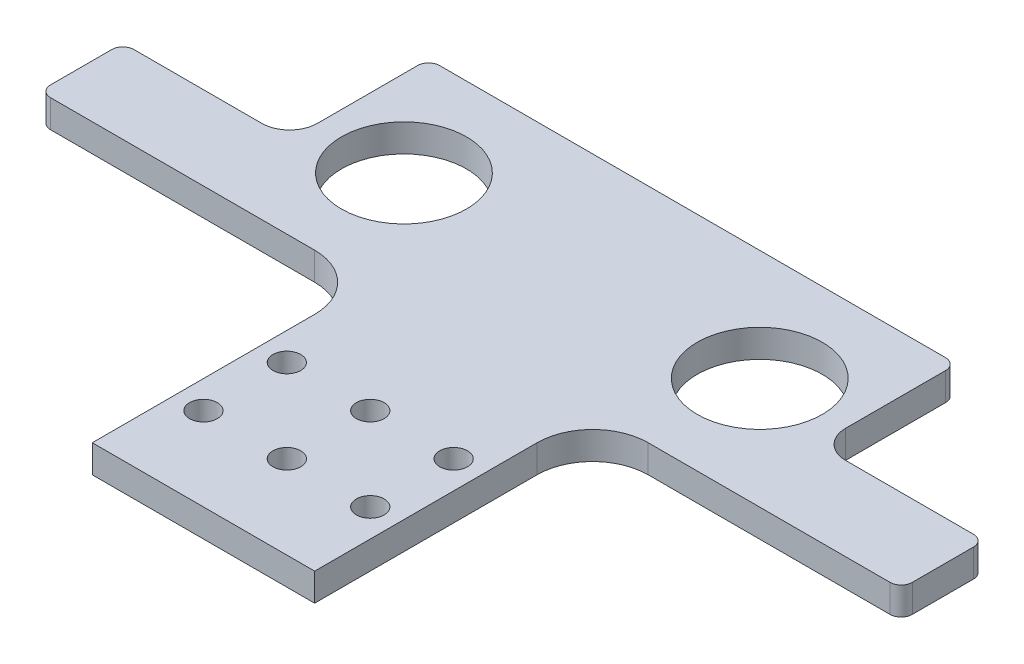
ISO-10303-21;
HEADER;
FILE_DESCRIPTION(('STEP AP214'),'2;1');
FILE_NAME('part.step','',(''),(''),'','','');
FILE_SCHEMA(('AUTOMOTIVE_DESIGN { 1 0 10303 214 1 1 1 1 }'));
ENDSEC;
DATA;
#1=APPLICATION_CONTEXT('core data for automotive mechanical design processes');
#2=APPLICATION_PROTOCOL_DEFINITION('international standard','automotive_design',2000,#1);
#3=PRODUCT_CONTEXT('',#1,'mechanical');
#4=PRODUCT('Part','Part','',(#3));
#5=PRODUCT_RELATED_PRODUCT_CATEGORY('part','',(#4));
#6=PRODUCT_DEFINITION_FORMATION('','',#4);
#7=PRODUCT_DEFINITION_CONTEXT('part definition',#1,'design');
#8=PRODUCT_DEFINITION('design','',#6,#7);
#9=PRODUCT_DEFINITION_SHAPE('','',#8);
#10=(LENGTH_UNIT() NAMED_UNIT(*) SI_UNIT(.MILLI.,.METRE.));
#11=(NAMED_UNIT(*) PLANE_ANGLE_UNIT() SI_UNIT($,.RADIAN.));
#12=(NAMED_UNIT(*) SI_UNIT($,.STERADIAN.) SOLID_ANGLE_UNIT());
#13=UNCERTAINTY_MEASURE_WITH_UNIT(LENGTH_MEASURE(1.E-05),#10,'distance_accuracy_value','');
#14=(GEOMETRIC_REPRESENTATION_CONTEXT(3) GLOBAL_UNCERTAINTY_ASSIGNED_CONTEXT((#13)) GLOBAL_UNIT_ASSIGNED_CONTEXT((#10,
#11,#12)) REPRESENTATION_CONTEXT('',''));
#15=CARTESIAN_POINT('',(0.,0.,0.));
#16=DIRECTION('',(0.,0.,1.));
#17=DIRECTION('',(1.,0.,0.));
#18=AXIS2_PLACEMENT_3D('',#15,#16,#17);
#19=CARTESIAN_POINT('',(29.5142708333333,0.,35.2689583333334));
#20=DIRECTION('',(0.,1.,0.));
#21=DIRECTION('',(0.,0.,1.));
#22=AXIS2_PLACEMENT_3D('',#19,#20,#21);
#23=CYLINDRICAL_SURFACE('',#22,3.175);
#24=CARTESIAN_POINT('',(29.5142708333333,0.,35.2689583333334));
#25=DIRECTION('',(0.,1.,0.));
#26=DIRECTION('',(0.,0.,1.));
#27=AXIS2_PLACEMENT_3D('',#24,#25,#26);
#28=CIRCLE('',#27,3.175);
#29=CARTESIAN_POINT('',(29.5142708333333,0.,38.4439583333333));
#30=VERTEX_POINT('',#29);
#31=EDGE_CURVE('E44',#30,#30,#28,.T.);
#32=ORIENTED_EDGE('',*,*,#31,.F.);
#33=EDGE_LOOP('',(#32));
#34=FACE_BOUND('',#33,.T.);
#35=CARTESIAN_POINT('',(29.5142708333333,6.35,35.2689583333334));
#36=DIRECTION('',(0.,1.,0.));
#37=DIRECTION('',(0.,0.,1.));
#38=AXIS2_PLACEMENT_3D('',#35,#36,#37);
#39=CIRCLE('',#38,3.175);
#40=CARTESIAN_POINT('',(29.5142708333333,6.35,38.4439583333333));
#41=VERTEX_POINT('',#40);
#42=EDGE_CURVE('E11',#41,#41,#39,.T.);
#43=ORIENTED_EDGE('',*,*,#42,.T.);
#44=EDGE_LOOP('',(#43));
#45=FACE_BOUND('',#44,.T.);
#46=ADVANCED_FACE('F37',(#34,#45),#23,.F.);
#47=CARTESIAN_POINT('',(10.4642708333333,0.,35.2689583333334));
#48=DIRECTION('',(0.,1.,0.));
#49=DIRECTION('',(0.,0.,1.));
#50=AXIS2_PLACEMENT_3D('',#47,#48,#49);
#51=CYLINDRICAL_SURFACE('',#50,3.175);
#52=CARTESIAN_POINT('',(10.4642708333333,0.,35.2689583333334));
#53=DIRECTION('',(0.,1.,0.));
#54=DIRECTION('',(0.,0.,1.));
#55=AXIS2_PLACEMENT_3D('',#52,#53,#54);
#56=CIRCLE('',#55,3.175);
#57=CARTESIAN_POINT('',(10.4642708333333,0.,38.4439583333333));
#58=VERTEX_POINT('',#57);
#59=EDGE_CURVE('E378',#58,#58,#56,.T.);
#60=ORIENTED_EDGE('',*,*,#59,.F.);
#61=EDGE_LOOP('',(#60));
#62=FACE_BOUND('',#61,.T.);
#63=CARTESIAN_POINT('',(10.4642708333333,6.35,35.2689583333334));
#64=DIRECTION('',(0.,1.,0.));
#65=DIRECTION('',(0.,0.,1.));
#66=AXIS2_PLACEMENT_3D('',#63,#64,#65);
#67=CIRCLE('',#66,3.175);
#68=CARTESIAN_POINT('',(10.4642708333333,6.35,38.4439583333333));
#69=VERTEX_POINT('',#68);
#70=EDGE_CURVE('E381',#69,#69,#67,.T.);
#71=ORIENTED_EDGE('',*,*,#70,.T.);
#72=EDGE_LOOP('',(#71));
#73=FACE_BOUND('',#72,.T.);
#74=ADVANCED_FACE('F389',(#62,#73),#51,.F.);
#75=CARTESIAN_POINT('',(-8.58572916666669,0.,35.2689583333334));
#76=DIRECTION('',(0.,1.,0.));
#77=DIRECTION('',(0.,0.,1.));
#78=AXIS2_PLACEMENT_3D('',#75,#76,#77);
#79=CYLINDRICAL_SURFACE('',#78,3.175);
#80=CARTESIAN_POINT('',(-8.58572916666669,0.,35.2689583333334));
#81=DIRECTION('',(0.,1.,0.));
#82=DIRECTION('',(0.,0.,1.));
#83=AXIS2_PLACEMENT_3D('',#80,#81,#82);
#84=CIRCLE('',#83,3.175);
#85=CARTESIAN_POINT('',(-8.58572916666669,0.,38.4439583333334));
#86=VERTEX_POINT('',#85);
#87=EDGE_CURVE('E372',#86,#86,#84,.T.);
#88=ORIENTED_EDGE('',*,*,#87,.F.);
#89=EDGE_LOOP('',(#88));
#90=FACE_BOUND('',#89,.T.);
#91=CARTESIAN_POINT('',(-8.58572916666669,6.35,35.2689583333334));
#92=DIRECTION('',(0.,1.,0.));
#93=DIRECTION('',(0.,0.,1.));
#94=AXIS2_PLACEMENT_3D('',#91,#92,#93);
#95=CIRCLE('',#94,3.175);
#96=CARTESIAN_POINT('',(-8.58572916666669,6.35,38.4439583333334));
#97=VERTEX_POINT('',#96);
#98=EDGE_CURVE('E375',#97,#97,#95,.T.);
#99=ORIENTED_EDGE('',*,*,#98,.T.);
#100=EDGE_LOOP('',(#99));
#101=FACE_BOUND('',#100,.T.);
#102=ADVANCED_FACE('F469',(#90,#101),#79,.F.);
#103=CARTESIAN_POINT('',(29.5142708333333,0.,54.3189583333333));
#104=DIRECTION('',(0.,1.,0.));
#105=DIRECTION('',(0.,0.,1.));
#106=AXIS2_PLACEMENT_3D('',#103,#104,#105);
#107=CYLINDRICAL_SURFACE('',#106,3.175);
#108=CARTESIAN_POINT('',(29.5142708333333,0.,54.3189583333333));
#109=DIRECTION('',(0.,1.,0.));
#110=DIRECTION('',(0.,0.,1.));
#111=AXIS2_PLACEMENT_3D('',#108,#109,#110);
#112=CIRCLE('',#111,3.175);
#113=CARTESIAN_POINT('',(29.5142708333333,0.,57.4939583333333));
#114=VERTEX_POINT('',#113);
#115=EDGE_CURVE('E366',#114,#114,#112,.T.);
#116=ORIENTED_EDGE('',*,*,#115,.F.);
#117=EDGE_LOOP('',(#116));
#118=FACE_BOUND('',#117,.T.);
#119=CARTESIAN_POINT('',(29.5142708333333,6.35,54.3189583333333));
#120=DIRECTION('',(0.,1.,0.));
#121=DIRECTION('',(0.,0.,1.));
#122=AXIS2_PLACEMENT_3D('',#119,#120,#121);
#123=CIRCLE('',#122,3.175);
#124=CARTESIAN_POINT('',(29.5142708333333,6.35,57.4939583333333));
#125=VERTEX_POINT('',#124);
#126=EDGE_CURVE('E369',#125,#125,#123,.T.);
#127=ORIENTED_EDGE('',*,*,#126,.T.);
#128=EDGE_LOOP('',(#127));
#129=FACE_BOUND('',#128,.T.);
#130=ADVANCED_FACE('F466',(#118,#129),#107,.F.);
#131=CARTESIAN_POINT('',(-52.4007291666667,6.35,9.86895833333334));
#132=DIRECTION('',(0.,0.,-1.));
#133=DIRECTION('',(-1.,0.,0.));
#134=AXIS2_PLACEMENT_3D('',#131,#132,#133);
#135=PLANE('',#134);
#136=DIRECTION('',(1.,0.,0.));
#137=VECTOR('',#136,1.);
#138=CARTESIAN_POINT('',(-52.4007291666667,6.35,9.86895833333334));
#139=LINE('',#138,#137);
#140=CARTESIAN_POINT('',(48.5642708333333,6.35,9.86895833333334));
#141=VERTEX_POINT('',#140);
#142=CARTESIAN_POINT('',(103.809270833333,6.35,9.86895833333334));
#143=VERTEX_POINT('',#142);
#144=EDGE_CURVE('E263',#141,#143,#139,.T.);
#145=ORIENTED_EDGE('',*,*,#144,.F.);
#146=DIRECTION('',(0.,1.,0.));
#147=VECTOR('',#146,1.);
#148=CARTESIAN_POINT('',(48.5642708333333,0.,9.86895833333334));
#149=LINE('',#148,#147);
#150=CARTESIAN_POINT('',(48.5642708333333,0.,9.86895833333334));
#151=VERTEX_POINT('',#150);
#152=EDGE_CURVE('E353',#141,#151,#149,.F.);
#153=ORIENTED_EDGE('',*,*,#152,.T.);
#154=DIRECTION('',(1.,0.,0.));
#155=VECTOR('',#154,1.);
#156=CARTESIAN_POINT('',(-52.4007291666667,0.,9.86895833333334));
#157=LINE('',#156,#155);
#158=CARTESIAN_POINT('',(103.809270833333,0.,9.86895833333334));
#159=VERTEX_POINT('',#158);
#160=EDGE_CURVE('E274',#151,#159,#157,.T.);
#161=ORIENTED_EDGE('',*,*,#160,.T.);
#162=DIRECTION('',(0.,1.,0.));
#163=VECTOR('',#162,1.);
#164=CARTESIAN_POINT('',(103.809270833333,6.35,9.86895833333334));
#165=LINE('',#164,#163);
#166=EDGE_CURVE('E297',#159,#143,#165,.T.);
#167=ORIENTED_EDGE('',*,*,#166,.T.);
#168=EDGE_LOOP('',(#145,#153,#161,#167));
#169=FACE_BOUND('',#168,.T.);
#170=ADVANCED_FACE('F407',(#169),#135,.F.);
#171=CARTESIAN_POINT('',(68.2492708333333,6.35,9.86895833333334));
#172=DIRECTION('',(-1.,0.,0.));
#173=DIRECTION('',(0.,0.,1.));
#174=AXIS2_PLACEMENT_3D('',#171,#172,#173);
#175=PLANE('',#174);
#176=DIRECTION('',(0.,0.,-1.));
#177=VECTOR('',#176,1.);
#178=CARTESIAN_POINT('',(68.2492708333333,0.,9.86895833333334));
#179=LINE('',#178,#177);
#180=CARTESIAN_POINT('',(68.2492708333333,0.,-15.5310416666667));
#181=VERTEX_POINT('',#180);
#182=CARTESIAN_POINT('',(68.2492708333333,0.,-38.3910416666667));
#183=VERTEX_POINT('',#182);
#184=EDGE_CURVE('E251',#181,#183,#179,.T.);
#185=ORIENTED_EDGE('',*,*,#184,.T.);
#186=DIRECTION('',(0.,-1.,0.));
#187=VECTOR('',#186,1.);
#188=CARTESIAN_POINT('',(68.2492708333333,6.35,-38.3910416666667));
#189=LINE('',#188,#187);
#190=CARTESIAN_POINT('',(68.2492708333333,6.35,-38.3910416666667));
#191=VERTEX_POINT('',#190);
#192=EDGE_CURVE('E348',#183,#191,#189,.F.);
#193=ORIENTED_EDGE('',*,*,#192,.T.);
#194=DIRECTION('',(0.,0.,-1.));
#195=VECTOR('',#194,1.);
#196=CARTESIAN_POINT('',(68.2492708333333,6.35,9.86895833333334));
#197=LINE('',#196,#195);
#198=CARTESIAN_POINT('',(68.2492708333333,6.35,-15.5310416666667));
#199=VERTEX_POINT('',#198);
#200=EDGE_CURVE('E254',#199,#191,#197,.T.);
#201=ORIENTED_EDGE('',*,*,#200,.F.);
#202=DIRECTION('',(0.,1.,0.));
#203=VECTOR('',#202,1.);
#204=CARTESIAN_POINT('',(68.2492708333333,0.,-15.5310416666667));
#205=LINE('',#204,#203);
#206=EDGE_CURVE('E279',#199,#181,#205,.F.);
#207=ORIENTED_EDGE('',*,*,#206,.T.);
#208=EDGE_LOOP('',(#185,#193,#201,#207));
#209=FACE_BOUND('',#208,.T.);
#210=ADVANCED_FACE('F419',(#209),#175,.F.);
#211=CARTESIAN_POINT('',(-52.4007291666667,6.35,-40.9310416666667));
#212=DIRECTION('',(0.,0.,1.));
#213=DIRECTION('',(1.,0.,0.));
#214=AXIS2_PLACEMENT_3D('',#211,#212,#213);
#215=PLANE('',#214);
#216=DIRECTION('',(-1.,0.,0.));
#217=VECTOR('',#216,1.);
#218=CARTESIAN_POINT('',(-52.4007291666667,0.,-40.9310416666667));
#219=LINE('',#218,#217);
#220=CARTESIAN_POINT('',(65.7092708333333,0.,-40.9310416666667));
#221=VERTEX_POINT('',#220);
#222=CARTESIAN_POINT('',(-49.8607291666667,0.,-40.9310416666667));
#223=VERTEX_POINT('',#222);
#224=EDGE_CURVE('E269',#221,#223,#219,.T.);
#225=ORIENTED_EDGE('',*,*,#224,.T.);
#226=DIRECTION('',(0.,-1.,0.));
#227=VECTOR('',#226,1.);
#228=CARTESIAN_POINT('',(-49.8607291666667,6.35,-40.9310416666667));
#229=LINE('',#228,#227);
#230=CARTESIAN_POINT('',(-49.8607291666667,6.35,-40.9310416666667));
#231=VERTEX_POINT('',#230);
#232=EDGE_CURVE('E346',#223,#231,#229,.F.);
#233=ORIENTED_EDGE('',*,*,#232,.T.);
#234=DIRECTION('',(-1.,0.,0.));
#235=VECTOR('',#234,1.);
#236=CARTESIAN_POINT('',(-52.4007291666667,6.35,-40.9310416666667));
#237=LINE('',#236,#235);
#238=CARTESIAN_POINT('',(65.7092708333333,6.35,-40.9310416666667));
#239=VERTEX_POINT('',#238);
#240=EDGE_CURVE('E257',#239,#231,#237,.T.);
#241=ORIENTED_EDGE('',*,*,#240,.F.);
#242=DIRECTION('',(0.,-1.,0.));
#243=VECTOR('',#242,1.);
#244=CARTESIAN_POINT('',(65.7092708333333,6.35,-40.9310416666667));
#245=LINE('',#244,#243);
#246=EDGE_CURVE('E343',#239,#221,#245,.T.);
#247=ORIENTED_EDGE('',*,*,#246,.T.);
#248=EDGE_LOOP('',(#225,#233,#241,#247));
#249=FACE_BOUND('',#248,.T.);
#250=ADVANCED_FACE('F415',(#249),#215,.F.);
#251=CARTESIAN_POINT('',(-52.4007291666667,6.35,9.86895833333334));
#252=DIRECTION('',(1.,0.,0.));
#253=DIRECTION('',(0.,0.,-1.));
#254=AXIS2_PLACEMENT_3D('',#251,#252,#253);
#255=PLANE('',#254);
#256=DIRECTION('',(0.,0.,1.));
#257=VECTOR('',#256,1.);
#258=CARTESIAN_POINT('',(-52.4007291666667,6.35,9.86895833333334));
#259=LINE('',#258,#257);
#260=CARTESIAN_POINT('',(-52.4007291666667,6.35,-38.3910416666667));
#261=VERTEX_POINT('',#260);
#262=CARTESIAN_POINT('',(-52.4007291666667,6.35,-15.5310416666667));
#263=VERTEX_POINT('',#262);
#264=EDGE_CURVE('E261',#261,#263,#259,.T.);
#265=ORIENTED_EDGE('',*,*,#264,.F.);
#266=DIRECTION('',(0.,-1.,0.));
#267=VECTOR('',#266,1.);
#268=CARTESIAN_POINT('',(-52.4007291666667,6.35,-38.3910416666667));
#269=LINE('',#268,#267);
#270=CARTESIAN_POINT('',(-52.4007291666667,0.,-38.3910416666667));
#271=VERTEX_POINT('',#270);
#272=EDGE_CURVE('E340',#261,#271,#269,.T.);
#273=ORIENTED_EDGE('',*,*,#272,.T.);
#274=DIRECTION('',(0.,0.,1.));
#275=VECTOR('',#274,1.);
#276=CARTESIAN_POINT('',(-52.4007291666667,0.,9.86895833333334));
#277=LINE('',#276,#275);
#278=CARTESIAN_POINT('',(-52.4007291666667,0.,-15.5310416666667));
#279=VERTEX_POINT('',#278);
#280=EDGE_CURVE('E272',#271,#279,#277,.T.);
#281=ORIENTED_EDGE('',*,*,#280,.T.);
#282=DIRECTION('',(0.,1.,0.));
#283=VECTOR('',#282,1.);
#284=CARTESIAN_POINT('',(-52.4007291666667,6.35,-15.5310416666667));
#285=LINE('',#284,#283);
#286=EDGE_CURVE('E281',#279,#263,#285,.T.);
#287=ORIENTED_EDGE('',*,*,#286,.T.);
#288=EDGE_LOOP('',(#265,#273,#281,#287));
#289=FACE_BOUND('',#288,.T.);
#290=ADVANCED_FACE('F404',(#289),#255,.F.);
#291=CARTESIAN_POINT('',(-87.9607291666666,0.,9.86895833333334));
#292=VERTEX_POINT('',#291);
#293=CARTESIAN_POINT('',(-27.6357291666667,0.,9.86895833333334));
#294=VERTEX_POINT('',#293);
#295=EDGE_CURVE('E258',#292,#294,#157,.T.);
#296=ORIENTED_EDGE('',*,*,#295,.T.);
#297=DIRECTION('',(0.,1.,0.));
#298=VECTOR('',#297,1.);
#299=CARTESIAN_POINT('',(-27.6357291666667,6.35,9.86895833333334));
#300=LINE('',#299,#298);
#301=CARTESIAN_POINT('',(-27.6357291666667,6.35,9.86895833333334));
#302=VERTEX_POINT('',#301);
#303=EDGE_CURVE('E355',#294,#302,#300,.T.);
#304=ORIENTED_EDGE('',*,*,#303,.T.);
#305=CARTESIAN_POINT('',(-87.9607291666666,6.35,9.86895833333334));
#306=VERTEX_POINT('',#305);
#307=EDGE_CURVE('E264',#306,#302,#139,.T.);
#308=ORIENTED_EDGE('',*,*,#307,.F.);
#309=DIRECTION('',(0.,1.,0.));
#310=VECTOR('',#309,1.);
#311=CARTESIAN_POINT('',(-87.9607291666667,0.,9.86895833333334));
#312=LINE('',#311,#310);
#313=EDGE_CURVE('E295',#306,#292,#312,.F.);
#314=ORIENTED_EDGE('',*,*,#313,.T.);
#315=EDGE_LOOP('',(#296,#304,#308,#314));
#316=FACE_BOUND('',#315,.T.);
#317=ADVANCED_FACE('F394',(#316),#135,.F.);
#318=CARTESIAN_POINT('',(0.,6.35,0.));
#319=DIRECTION('',(0.,-1.,0.));
#320=DIRECTION('',(0.,0.,-1.));
#321=AXIS2_PLACEMENT_3D('',#318,#319,#320);
#322=PLANE('',#321);
#323=CARTESIAN_POINT('',(10.4642708333333,6.35,54.3189583333334));
#324=DIRECTION('',(0.,1.,0.));
#325=DIRECTION('',(0.,0.,1.));
#326=AXIS2_PLACEMENT_3D('',#323,#324,#325);
#327=CIRCLE('',#326,3.175);
#328=CARTESIAN_POINT('',(10.4642708333333,6.35,57.4939583333334));
#329=VERTEX_POINT('',#328);
#330=EDGE_CURVE('E871',#329,#329,#327,.T.);
#331=ORIENTED_EDGE('',*,*,#330,.F.);
#332=EDGE_LOOP('',(#331));
#333=FACE_BOUND('',#332,.T.);
#334=CARTESIAN_POINT('',(-8.58572916666669,6.35,54.3189583333334));
#335=DIRECTION('',(0.,1.,0.));
#336=DIRECTION('',(0.,0.,1.));
#337=AXIS2_PLACEMENT_3D('',#334,#335,#336);
#338=CIRCLE('',#337,3.175);
#339=CARTESIAN_POINT('',(-8.58572916666669,6.35,57.4939583333334));
#340=VERTEX_POINT('',#339);
#341=EDGE_CURVE('E872',#340,#340,#338,.T.);
#342=ORIENTED_EDGE('',*,*,#341,.F.);
#343=EDGE_LOOP('',(#342));
#344=FACE_BOUND('',#343,.T.);
#345=CARTESIAN_POINT('',(48.5642708333333,6.35,-15.6147880502648));
#346=DIRECTION('',(0.,-1.,0.));
#347=DIRECTION('',(0.,0.,1.));
#348=AXIS2_PLACEMENT_3D('',#345,#346,#347);
#349=CIRCLE('',#348,14.2875);
#350=CARTESIAN_POINT('',(48.5642708333333,6.35,-1.32728805026484));
#351=VERTEX_POINT('',#350);
#352=EDGE_CURVE('E237',#351,#351,#349,.T.);
#353=ORIENTED_EDGE('',*,*,#352,.T.);
#354=EDGE_LOOP('',(#353));
#355=FACE_BOUND('',#354,.T.);
#356=CARTESIAN_POINT('',(-32.7157291666667,6.35,-15.6147880502648));
#357=DIRECTION('',(0.,1.,0.));
#358=DIRECTION('',(0.,0.,1.));
#359=AXIS2_PLACEMENT_3D('',#356,#357,#358);
#360=CIRCLE('',#359,14.2875);
#361=CARTESIAN_POINT('',(-32.7157291666667,6.35,-1.32728805026483));
#362=VERTEX_POINT('',#361);
#363=EDGE_CURVE('E245',#362,#362,#360,.T.);
#364=ORIENTED_EDGE('',*,*,#363,.F.);
#365=EDGE_LOOP('',(#364));
#366=FACE_BOUND('',#365,.T.);
#367=ORIENTED_EDGE('',*,*,#307,.T.);
#368=CARTESIAN_POINT('',(-27.6357291666667,6.35,22.5689583333333));
#369=DIRECTION('',(0.,-1.,0.));
#370=DIRECTION('',(0.,0.,-1.));
#371=AXIS2_PLACEMENT_3D('',#368,#369,#370);
#372=CIRCLE('',#371,12.7);
#373=CARTESIAN_POINT('',(-14.9357291666667,6.35,22.5689583333333));
#374=VERTEX_POINT('',#373);
#375=EDGE_CURVE('E59',#302,#374,#372,.T.);
#376=ORIENTED_EDGE('',*,*,#375,.T.);
#377=DIRECTION('',(0.,0.,1.));
#378=VECTOR('',#377,1.);
#379=CARTESIAN_POINT('',(-14.9357291666667,6.35,9.86895833333334));
#380=LINE('',#379,#378);
#381=CARTESIAN_POINT('',(-14.9357291666667,6.35,73.3689583333334));
#382=VERTEX_POINT('',#381);
#383=EDGE_CURVE('E212',#374,#382,#380,.T.);
#384=ORIENTED_EDGE('',*,*,#383,.T.);
#385=DIRECTION('',(1.,0.,0.));
#386=VECTOR('',#385,1.);
#387=CARTESIAN_POINT('',(-14.9357291666667,6.35,73.3689583333334));
#388=LINE('',#387,#386);
#389=CARTESIAN_POINT('',(35.8642708333333,6.35,73.3689583333333));
#390=VERTEX_POINT('',#389);
#391=EDGE_CURVE('E199',#382,#390,#388,.T.);
#392=ORIENTED_EDGE('',*,*,#391,.T.);
#393=DIRECTION('',(0.,0.,1.));
#394=VECTOR('',#393,1.);
#395=CARTESIAN_POINT('',(35.8642708333333,6.35,9.86895833333334));
#396=LINE('',#395,#394);
#397=CARTESIAN_POINT('',(35.8642708333333,6.35,22.5689583333333));
#398=VERTEX_POINT('',#397);
#399=EDGE_CURVE('E192',#398,#390,#396,.T.);
#400=ORIENTED_EDGE('',*,*,#399,.F.);
#401=CARTESIAN_POINT('',(48.5642708333333,6.35,22.5689583333333));
#402=DIRECTION('',(0.,-1.,0.));
#403=DIRECTION('',(0.,0.,-1.));
#404=AXIS2_PLACEMENT_3D('',#401,#402,#403);
#405=CIRCLE('',#404,12.7);
#406=EDGE_CURVE('E359',#398,#141,#405,.T.);
#407=ORIENTED_EDGE('',*,*,#406,.T.);
#408=ORIENTED_EDGE('',*,*,#144,.T.);
#409=CARTESIAN_POINT('',(103.809270833333,6.35,7.32895833333334));
#410=DIRECTION('',(0.,-1.,0.));
#411=DIRECTION('',(0.,0.,-1.));
#412=AXIS2_PLACEMENT_3D('',#409,#410,#411);
#413=CIRCLE('',#412,2.54);
#414=CARTESIAN_POINT('',(106.349270833333,6.35,7.32895833333334));
#415=VERTEX_POINT('',#414);
#416=EDGE_CURVE('E310',#143,#415,#413,.F.);
#417=ORIENTED_EDGE('',*,*,#416,.T.);
#418=DIRECTION('',(0.,0.,1.));
#419=VECTOR('',#418,1.);
#420=CARTESIAN_POINT('',(106.349270833333,6.35,-9.18104166666668));
#421=LINE('',#420,#419);
#422=CARTESIAN_POINT('',(106.349270833333,6.35,-6.64104166666668));
#423=VERTEX_POINT('',#422);
#424=EDGE_CURVE('E217',#423,#415,#421,.T.);
#425=ORIENTED_EDGE('',*,*,#424,.F.);
#426=CARTESIAN_POINT('',(103.809270833333,6.35,-6.64104166666668));
#427=DIRECTION('',(0.,-1.,0.));
#428=DIRECTION('',(0.,0.,-1.));
#429=AXIS2_PLACEMENT_3D('',#426,#427,#428);
#430=CIRCLE('',#429,2.54);
#431=CARTESIAN_POINT('',(103.809270833333,6.35,-9.18104166666668));
#432=VERTEX_POINT('',#431);
#433=EDGE_CURVE('E308',#423,#432,#430,.F.);
#434=ORIENTED_EDGE('',*,*,#433,.T.);
#435=DIRECTION('',(1.,0.,0.));
#436=VECTOR('',#435,1.);
#437=CARTESIAN_POINT('',(106.349270833333,6.35,-9.18104166666668));
#438=LINE('',#437,#436);
#439=CARTESIAN_POINT('',(74.5992708333333,6.35,-9.18104166666667));
#440=VERTEX_POINT('',#439);
#441=EDGE_CURVE('E222',#440,#432,#438,.T.);
#442=ORIENTED_EDGE('',*,*,#441,.F.);
#443=CARTESIAN_POINT('',(74.5992708333333,6.35,-15.5310416666667));
#444=DIRECTION('',(0.,-1.,0.));
#445=DIRECTION('',(0.,0.,-1.));
#446=AXIS2_PLACEMENT_3D('',#443,#444,#445);
#447=CIRCLE('',#446,6.35);
#448=EDGE_CURVE('E286',#440,#199,#447,.T.);
#449=ORIENTED_EDGE('',*,*,#448,.T.);
#450=ORIENTED_EDGE('',*,*,#200,.T.);
#451=CARTESIAN_POINT('',(65.7092708333333,6.35,-38.3910416666667));
#452=DIRECTION('',(0.,-1.,0.));
#453=DIRECTION('',(0.,0.,-1.));
#454=AXIS2_PLACEMENT_3D('',#451,#452,#453);
#455=CIRCLE('',#454,2.54);
#456=EDGE_CURVE('E300',#191,#239,#455,.F.);
#457=ORIENTED_EDGE('',*,*,#456,.T.);
#458=ORIENTED_EDGE('',*,*,#240,.T.);
#459=CARTESIAN_POINT('',(-49.8607291666667,6.35,-38.3910416666667));
#460=DIRECTION('',(0.,-1.,0.));
#461=DIRECTION('',(0.,0.,-1.));
#462=AXIS2_PLACEMENT_3D('',#459,#460,#461);
#463=CIRCLE('',#462,2.54);
#464=EDGE_CURVE('E302',#231,#261,#463,.F.);
#465=ORIENTED_EDGE('',*,*,#464,.T.);
#466=ORIENTED_EDGE('',*,*,#264,.T.);
#467=CARTESIAN_POINT('',(-58.7507291666667,6.35,-15.5310416666667));
#468=DIRECTION('',(0.,-1.,0.));
#469=DIRECTION('',(0.,0.,-1.));
#470=AXIS2_PLACEMENT_3D('',#467,#468,#469);
#471=CIRCLE('',#470,6.35);
#472=CARTESIAN_POINT('',(-58.7507291666667,6.35,-9.18104166666666));
#473=VERTEX_POINT('',#472);
#474=EDGE_CURVE('E290',#263,#473,#471,.T.);
#475=ORIENTED_EDGE('',*,*,#474,.T.);
#476=DIRECTION('',(-1.,0.,0.));
#477=VECTOR('',#476,1.);
#478=CARTESIAN_POINT('',(-90.5007291666667,6.35,-9.18104166666666));
#479=LINE('',#478,#477);
#480=CARTESIAN_POINT('',(-87.9607291666667,6.35,-9.18104166666666));
#481=VERTEX_POINT('',#480);
#482=EDGE_CURVE('E234',#473,#481,#479,.T.);
#483=ORIENTED_EDGE('',*,*,#482,.T.);
#484=CARTESIAN_POINT('',(-87.9607291666667,6.35,-6.64104166666666));
#485=DIRECTION('',(0.,-1.,0.));
#486=DIRECTION('',(0.,0.,-1.));
#487=AXIS2_PLACEMENT_3D('',#484,#485,#486);
#488=CIRCLE('',#487,2.54);
#489=CARTESIAN_POINT('',(-90.5007291666667,6.35,-6.64104166666666));
#490=VERTEX_POINT('',#489);
#491=EDGE_CURVE('E304',#481,#490,#488,.F.);
#492=ORIENTED_EDGE('',*,*,#491,.T.);
#493=DIRECTION('',(0.,0.,1.));
#494=VECTOR('',#493,1.);
#495=CARTESIAN_POINT('',(-90.5007291666667,6.35,-9.18104166666666));
#496=LINE('',#495,#494);
#497=CARTESIAN_POINT('',(-90.5007291666667,6.35,7.32895833333334));
#498=VERTEX_POINT('',#497);
#499=EDGE_CURVE('E225',#490,#498,#496,.T.);
#500=ORIENTED_EDGE('',*,*,#499,.T.);
#501=CARTESIAN_POINT('',(-87.9607291666667,6.35,7.32895833333334));
#502=DIRECTION('',(0.,-1.,0.));
#503=DIRECTION('',(0.,0.,-1.));
#504=AXIS2_PLACEMENT_3D('',#501,#502,#503);
#505=CIRCLE('',#504,2.54);
#506=EDGE_CURVE('E306',#498,#306,#505,.F.);
#507=ORIENTED_EDGE('',*,*,#506,.T.);
#508=EDGE_LOOP('',(#367,#376,#384,#392,#400,#407,#408,#417,#425,#434,#442,#449,#450,#457,#458,
#465,#466,#475,#483,#492,#500,#507));
#509=FACE_BOUND('',#508,.T.);
#510=ORIENTED_EDGE('',*,*,#126,.F.);
#511=EDGE_LOOP('',(#510));
#512=FACE_BOUND('',#511,.T.);
#513=ORIENTED_EDGE('',*,*,#98,.F.);
#514=EDGE_LOOP('',(#513));
#515=FACE_BOUND('',#514,.T.);
#516=ORIENTED_EDGE('',*,*,#70,.F.);
#517=EDGE_LOOP('',(#516));
#518=FACE_BOUND('',#517,.T.);
#519=ORIENTED_EDGE('',*,*,#42,.F.);
#520=EDGE_LOOP('',(#519));
#521=FACE_BOUND('',#520,.T.);
#522=ADVANCED_FACE('F392',(#333,#344,#355,#366,#509,#512,#515,#518,#521),#322,.F.);
#523=CARTESIAN_POINT('',(0.,0.,0.));
#524=DIRECTION('',(0.,-1.,0.));
#525=DIRECTION('',(0.,0.,-1.));
#526=AXIS2_PLACEMENT_3D('',#523,#524,#525);
#527=PLANE('',#526);
#528=CARTESIAN_POINT('',(10.4642708333333,0.,54.3189583333334));
#529=DIRECTION('',(0.,1.,0.));
#530=DIRECTION('',(0.,0.,1.));
#531=AXIS2_PLACEMENT_3D('',#528,#529,#530);
#532=CIRCLE('',#531,3.175);
#533=CARTESIAN_POINT('',(10.4642708333333,0.,57.4939583333334));
#534=VERTEX_POINT('',#533);
#535=EDGE_CURVE('E869',#534,#534,#532,.T.);
#536=ORIENTED_EDGE('',*,*,#535,.T.);
#537=EDGE_LOOP('',(#536));
#538=FACE_BOUND('',#537,.T.);
#539=CARTESIAN_POINT('',(-8.58572916666669,0.,54.3189583333334));
#540=DIRECTION('',(0.,1.,0.));
#541=DIRECTION('',(0.,0.,1.));
#542=AXIS2_PLACEMENT_3D('',#539,#540,#541);
#543=CIRCLE('',#542,3.175);
#544=CARTESIAN_POINT('',(-8.58572916666669,0.,57.4939583333334));
#545=VERTEX_POINT('',#544);
#546=EDGE_CURVE('E214',#545,#545,#543,.T.);
#547=ORIENTED_EDGE('',*,*,#546,.T.);
#548=EDGE_LOOP('',(#547));
#549=FACE_BOUND('',#548,.T.);
#550=CARTESIAN_POINT('',(48.5642708333333,0.,-15.6147880502648));
#551=DIRECTION('',(0.,-1.,0.));
#552=DIRECTION('',(0.,0.,1.));
#553=AXIS2_PLACEMENT_3D('',#550,#551,#552);
#554=CIRCLE('',#553,14.2875);
#555=CARTESIAN_POINT('',(48.5642708333333,0.,-1.32728805026484));
#556=VERTEX_POINT('',#555);
#557=EDGE_CURVE('E242',#556,#556,#554,.T.);
#558=ORIENTED_EDGE('',*,*,#557,.F.);
#559=EDGE_LOOP('',(#558));
#560=FACE_BOUND('',#559,.T.);
#561=CARTESIAN_POINT('',(-32.7157291666667,0.,-15.6147880502648));
#562=DIRECTION('',(0.,1.,0.));
#563=DIRECTION('',(0.,0.,1.));
#564=AXIS2_PLACEMENT_3D('',#561,#562,#563);
#565=CIRCLE('',#564,14.2875);
#566=CARTESIAN_POINT('',(-32.7157291666667,0.,-1.32728805026483));
#567=VERTEX_POINT('',#566);
#568=EDGE_CURVE('E248',#567,#567,#565,.T.);
#569=ORIENTED_EDGE('',*,*,#568,.T.);
#570=EDGE_LOOP('',(#569));
#571=FACE_BOUND('',#570,.T.);
#572=DIRECTION('',(0.,0.,1.));
#573=VECTOR('',#572,1.);
#574=CARTESIAN_POINT('',(106.349270833333,0.,-9.18104166666668));
#575=LINE('',#574,#573);
#576=CARTESIAN_POINT('',(106.349270833333,0.,-6.64104166666668));
#577=VERTEX_POINT('',#576);
#578=CARTESIAN_POINT('',(106.349270833333,0.,7.32895833333334));
#579=VERTEX_POINT('',#578);
#580=EDGE_CURVE('E219',#577,#579,#575,.T.);
#581=ORIENTED_EDGE('',*,*,#580,.T.);
#582=CARTESIAN_POINT('',(103.809270833333,0.,7.32895833333334));
#583=DIRECTION('',(0.,-1.,0.));
#584=DIRECTION('',(0.,0.,-1.));
#585=AXIS2_PLACEMENT_3D('',#582,#583,#584);
#586=CIRCLE('',#585,2.54);
#587=EDGE_CURVE('E327',#579,#159,#586,.T.);
#588=ORIENTED_EDGE('',*,*,#587,.T.);
#589=ORIENTED_EDGE('',*,*,#160,.F.);
#590=CARTESIAN_POINT('',(48.5642708333333,0.,22.5689583333333));
#591=DIRECTION('',(0.,-1.,0.));
#592=DIRECTION('',(0.,0.,-1.));
#593=AXIS2_PLACEMENT_3D('',#590,#591,#592);
#594=CIRCLE('',#593,12.7);
#595=CARTESIAN_POINT('',(35.8642708333333,0.,22.5689583333333));
#596=VERTEX_POINT('',#595);
#597=EDGE_CURVE('E361',#151,#596,#594,.F.);
#598=ORIENTED_EDGE('',*,*,#597,.T.);
#599=DIRECTION('',(0.,0.,1.));
#600=VECTOR('',#599,1.);
#601=CARTESIAN_POINT('',(35.8642708333333,0.,9.86895833333334));
#602=LINE('',#601,#600);
#603=CARTESIAN_POINT('',(35.8642708333333,0.,73.3689583333333));
#604=VERTEX_POINT('',#603);
#605=EDGE_CURVE('E201',#596,#604,#602,.T.);
#606=ORIENTED_EDGE('',*,*,#605,.T.);
#607=DIRECTION('',(1.,0.,0.));
#608=VECTOR('',#607,1.);
#609=CARTESIAN_POINT('',(-14.9357291666667,0.,73.3689583333334));
#610=LINE('',#609,#608);
#611=CARTESIAN_POINT('',(-14.9357291666667,0.,73.3689583333334));
#612=VERTEX_POINT('',#611);
#613=EDGE_CURVE('E191',#612,#604,#610,.T.);
#614=ORIENTED_EDGE('',*,*,#613,.F.);
#615=DIRECTION('',(0.,0.,1.));
#616=VECTOR('',#615,1.);
#617=CARTESIAN_POINT('',(-14.9357291666667,0.,9.86895833333334));
#618=LINE('',#617,#616);
#619=CARTESIAN_POINT('',(-14.9357291666667,0.,22.5689583333333));
#620=VERTEX_POINT('',#619);
#621=EDGE_CURVE('E183',#620,#612,#618,.T.);
#622=ORIENTED_EDGE('',*,*,#621,.F.);
#623=CARTESIAN_POINT('',(-27.6357291666667,0.,22.5689583333333));
#624=DIRECTION('',(0.,-1.,0.));
#625=DIRECTION('',(0.,0.,-1.));
#626=AXIS2_PLACEMENT_3D('',#623,#624,#625);
#627=CIRCLE('',#626,12.7);
#628=EDGE_CURVE('E364',#620,#294,#627,.F.);
#629=ORIENTED_EDGE('',*,*,#628,.T.);
#630=ORIENTED_EDGE('',*,*,#295,.F.);
#631=CARTESIAN_POINT('',(-87.9607291666667,0.,7.32895833333334));
#632=DIRECTION('',(0.,-1.,0.));
#633=DIRECTION('',(0.,0.,-1.));
#634=AXIS2_PLACEMENT_3D('',#631,#632,#633);
#635=CIRCLE('',#634,2.54);
#636=CARTESIAN_POINT('',(-90.5007291666667,0.,7.32895833333334));
#637=VERTEX_POINT('',#636);
#638=EDGE_CURVE('E323',#292,#637,#635,.T.);
#639=ORIENTED_EDGE('',*,*,#638,.T.);
#640=DIRECTION('',(0.,0.,1.));
#641=VECTOR('',#640,1.);
#642=CARTESIAN_POINT('',(-90.5007291666667,0.,-9.18104166666666));
#643=LINE('',#642,#641);
#644=CARTESIAN_POINT('',(-90.5007291666667,0.,-6.64104166666666));
#645=VERTEX_POINT('',#644);
#646=EDGE_CURVE('E230',#645,#637,#643,.T.);
#647=ORIENTED_EDGE('',*,*,#646,.F.);
#648=CARTESIAN_POINT('',(-87.9607291666667,0.,-6.64104166666666));
#649=DIRECTION('',(0.,-1.,0.));
#650=DIRECTION('',(0.,0.,-1.));
#651=AXIS2_PLACEMENT_3D('',#648,#649,#650);
#652=CIRCLE('',#651,2.54);
#653=CARTESIAN_POINT('',(-87.9607291666667,0.,-9.18104166666666));
#654=VERTEX_POINT('',#653);
#655=EDGE_CURVE('E321',#645,#654,#652,.T.);
#656=ORIENTED_EDGE('',*,*,#655,.T.);
#657=DIRECTION('',(-1.,0.,0.));
#658=VECTOR('',#657,1.);
#659=CARTESIAN_POINT('',(-90.5007291666667,0.,-9.18104166666666));
#660=LINE('',#659,#658);
#661=CARTESIAN_POINT('',(-58.7507291666667,0.,-9.18104166666666));
#662=VERTEX_POINT('',#661);
#663=EDGE_CURVE('E233',#662,#654,#660,.T.);
#664=ORIENTED_EDGE('',*,*,#663,.F.);
#665=CARTESIAN_POINT('',(-58.7507291666667,0.,-15.5310416666667));
#666=DIRECTION('',(0.,-1.,0.));
#667=DIRECTION('',(0.,0.,-1.));
#668=AXIS2_PLACEMENT_3D('',#665,#666,#667);
#669=CIRCLE('',#668,6.35);
#670=EDGE_CURVE('E292',#662,#279,#669,.F.);
#671=ORIENTED_EDGE('',*,*,#670,.T.);
#672=ORIENTED_EDGE('',*,*,#280,.F.);
#673=CARTESIAN_POINT('',(-49.8607291666667,0.,-38.3910416666667));
#674=DIRECTION('',(0.,-1.,0.));
#675=DIRECTION('',(0.,0.,-1.));
#676=AXIS2_PLACEMENT_3D('',#673,#674,#675);
#677=CIRCLE('',#676,2.54);
#678=EDGE_CURVE('E319',#271,#223,#677,.T.);
#679=ORIENTED_EDGE('',*,*,#678,.T.);
#680=ORIENTED_EDGE('',*,*,#224,.F.);
#681=CARTESIAN_POINT('',(65.7092708333333,0.,-38.3910416666667));
#682=DIRECTION('',(0.,-1.,0.));
#683=DIRECTION('',(0.,0.,-1.));
#684=AXIS2_PLACEMENT_3D('',#681,#682,#683);
#685=CIRCLE('',#684,2.54);
#686=EDGE_CURVE('E317',#221,#183,#685,.T.);
#687=ORIENTED_EDGE('',*,*,#686,.T.);
#688=ORIENTED_EDGE('',*,*,#184,.F.);
#689=CARTESIAN_POINT('',(74.5992708333333,0.,-15.5310416666667));
#690=DIRECTION('',(0.,-1.,0.));
#691=DIRECTION('',(0.,0.,-1.));
#692=AXIS2_PLACEMENT_3D('',#689,#690,#691);
#693=CIRCLE('',#692,6.35);
#694=CARTESIAN_POINT('',(74.5992708333333,0.,-9.18104166666667));
#695=VERTEX_POINT('',#694);
#696=EDGE_CURVE('E288',#181,#695,#693,.F.);
#697=ORIENTED_EDGE('',*,*,#696,.T.);
#698=DIRECTION('',(1.,0.,0.));
#699=VECTOR('',#698,1.);
#700=CARTESIAN_POINT('',(106.349270833333,0.,-9.18104166666668));
#701=LINE('',#700,#699);
#702=CARTESIAN_POINT('',(103.809270833333,0.,-9.18104166666668));
#703=VERTEX_POINT('',#702);
#704=EDGE_CURVE('E221',#695,#703,#701,.T.);
#705=ORIENTED_EDGE('',*,*,#704,.T.);
#706=CARTESIAN_POINT('',(103.809270833333,0.,-6.64104166666668));
#707=DIRECTION('',(0.,-1.,0.));
#708=DIRECTION('',(0.,0.,-1.));
#709=AXIS2_PLACEMENT_3D('',#706,#707,#708);
#710=CIRCLE('',#709,2.54);
#711=EDGE_CURVE('E325',#703,#577,#710,.T.);
#712=ORIENTED_EDGE('',*,*,#711,.T.);
#713=EDGE_LOOP('',(#581,#588,#589,#598,#606,#614,#622,#629,#630,#639,#647,#656,#664,#671,#672,
#679,#680,#687,#688,#697,#705,#712));
#714=FACE_BOUND('',#713,.T.);
#715=ORIENTED_EDGE('',*,*,#115,.T.);
#716=EDGE_LOOP('',(#715));
#717=FACE_BOUND('',#716,.T.);
#718=ORIENTED_EDGE('',*,*,#87,.T.);
#719=EDGE_LOOP('',(#718));
#720=FACE_BOUND('',#719,.T.);
#721=ORIENTED_EDGE('',*,*,#59,.T.);
#722=EDGE_LOOP('',(#721));
#723=FACE_BOUND('',#722,.T.);
#724=ORIENTED_EDGE('',*,*,#31,.T.);
#725=EDGE_LOOP('',(#724));
#726=FACE_BOUND('',#725,.T.);
#727=ADVANCED_FACE('F204',(#538,#549,#560,#571,#714,#717,#720,#723,#726),#527,.T.);
#728=CARTESIAN_POINT('',(-32.7157291666667,0.,-15.6147880502648));
#729=DIRECTION('',(0.,1.,0.));
#730=DIRECTION('',(0.,0.,1.));
#731=AXIS2_PLACEMENT_3D('',#728,#729,#730);
#732=CYLINDRICAL_SURFACE('',#731,14.2875);
#733=ORIENTED_EDGE('',*,*,#568,.F.);
#734=EDGE_LOOP('',(#733));
#735=FACE_BOUND('',#734,.T.);
#736=ORIENTED_EDGE('',*,*,#363,.T.);
#737=EDGE_LOOP('',(#736));
#738=FACE_BOUND('',#737,.T.);
#739=ADVANCED_FACE('F401',(#735,#738),#732,.F.);
#740=CARTESIAN_POINT('',(48.5642708333333,0.,-15.6147880502648));
#741=DIRECTION('',(0.,1.,0.));
#742=DIRECTION('',(0.,0.,1.));
#743=AXIS2_PLACEMENT_3D('',#740,#741,#742);
#744=CYLINDRICAL_SURFACE('',#743,14.2875);
#745=ORIENTED_EDGE('',*,*,#557,.T.);
#746=EDGE_LOOP('',(#745));
#747=FACE_BOUND('',#746,.T.);
#748=ORIENTED_EDGE('',*,*,#352,.F.);
#749=EDGE_LOOP('',(#748));
#750=FACE_BOUND('',#749,.T.);
#751=ADVANCED_FACE('F716',(#747,#750),#744,.F.);
#752=CARTESIAN_POINT('',(-90.5007291666667,0.,-9.18104166666666));
#753=DIRECTION('',(-1.,0.,0.));
#754=DIRECTION('',(0.,0.,1.));
#755=AXIS2_PLACEMENT_3D('',#752,#753,#754);
#756=PLANE('',#755);
#757=ORIENTED_EDGE('',*,*,#646,.T.);
#758=DIRECTION('',(0.,1.,0.));
#759=VECTOR('',#758,1.);
#760=CARTESIAN_POINT('',(-90.5007291666667,6.35,7.32895833333334));
#761=LINE('',#760,#759);
#762=EDGE_CURVE('E334',#637,#498,#761,.T.);
#763=ORIENTED_EDGE('',*,*,#762,.T.);
#764=ORIENTED_EDGE('',*,*,#499,.F.);
#765=DIRECTION('',(0.,1.,0.));
#766=VECTOR('',#765,1.);
#767=CARTESIAN_POINT('',(-90.5007291666667,0.,-6.64104166666666));
#768=LINE('',#767,#766);
#769=EDGE_CURVE('E332',#490,#645,#768,.F.);
#770=ORIENTED_EDGE('',*,*,#769,.T.);
#771=EDGE_LOOP('',(#757,#763,#764,#770));
#772=FACE_BOUND('',#771,.T.);
#773=ADVANCED_FACE('F706',(#772),#756,.T.);
#774=CARTESIAN_POINT('',(-90.5007291666667,0.,-9.18104166666666));
#775=DIRECTION('',(0.,0.,-1.));
#776=DIRECTION('',(-1.,0.,0.));
#777=AXIS2_PLACEMENT_3D('',#774,#775,#776);
#778=PLANE('',#777);
#779=ORIENTED_EDGE('',*,*,#663,.T.);
#780=DIRECTION('',(0.,1.,0.));
#781=VECTOR('',#780,1.);
#782=CARTESIAN_POINT('',(-87.9607291666667,0.,-9.18104166666666));
#783=LINE('',#782,#781);
#784=EDGE_CURVE('E337',#654,#481,#783,.T.);
#785=ORIENTED_EDGE('',*,*,#784,.T.);
#786=ORIENTED_EDGE('',*,*,#482,.F.);
#787=DIRECTION('',(0.,1.,0.));
#788=VECTOR('',#787,1.);
#789=CARTESIAN_POINT('',(-58.7507291666667,0.,-9.18104166666666));
#790=LINE('',#789,#788);
#791=EDGE_CURVE('E284',#473,#662,#790,.F.);
#792=ORIENTED_EDGE('',*,*,#791,.T.);
#793=EDGE_LOOP('',(#779,#785,#786,#792));
#794=FACE_BOUND('',#793,.T.);
#795=ADVANCED_FACE('F696',(#794),#778,.T.);
#796=CARTESIAN_POINT('',(106.349270833333,0.,-9.18104166666668));
#797=DIRECTION('',(-1.,0.,0.));
#798=DIRECTION('',(0.,0.,1.));
#799=AXIS2_PLACEMENT_3D('',#796,#797,#798);
#800=PLANE('',#799);
#801=ORIENTED_EDGE('',*,*,#424,.T.);
#802=DIRECTION('',(0.,1.,0.));
#803=VECTOR('',#802,1.);
#804=CARTESIAN_POINT('',(106.349270833333,0.,7.32895833333334));
#805=LINE('',#804,#803);
#806=EDGE_CURVE('E315',#415,#579,#805,.F.);
#807=ORIENTED_EDGE('',*,*,#806,.T.);
#808=ORIENTED_EDGE('',*,*,#580,.F.);
#809=DIRECTION('',(0.,1.,0.));
#810=VECTOR('',#809,1.);
#811=CARTESIAN_POINT('',(106.349270833333,0.,-6.64104166666668));
#812=LINE('',#811,#810);
#813=EDGE_CURVE('E312',#577,#423,#812,.T.);
#814=ORIENTED_EDGE('',*,*,#813,.T.);
#815=EDGE_LOOP('',(#801,#807,#808,#814));
#816=FACE_BOUND('',#815,.T.);
#817=ADVANCED_FACE('F684',(#816),#800,.F.);
#818=CARTESIAN_POINT('',(106.349270833333,0.,-9.18104166666668));
#819=DIRECTION('',(0.,0.,1.));
#820=DIRECTION('',(1.,0.,0.));
#821=AXIS2_PLACEMENT_3D('',#818,#819,#820);
#822=PLANE('',#821);
#823=ORIENTED_EDGE('',*,*,#441,.T.);
#824=DIRECTION('',(0.,1.,0.));
#825=VECTOR('',#824,1.);
#826=CARTESIAN_POINT('',(103.809270833333,0.,-9.18104166666668));
#827=LINE('',#826,#825);
#828=EDGE_CURVE('E330',#432,#703,#827,.F.);
#829=ORIENTED_EDGE('',*,*,#828,.T.);
#830=ORIENTED_EDGE('',*,*,#704,.F.);
#831=DIRECTION('',(0.,1.,0.));
#832=VECTOR('',#831,1.);
#833=CARTESIAN_POINT('',(74.5992708333333,6.35,-9.18104166666667));
#834=LINE('',#833,#832);
#835=EDGE_CURVE('E266',#695,#440,#834,.T.);
#836=ORIENTED_EDGE('',*,*,#835,.T.);
#837=EDGE_LOOP('',(#823,#829,#830,#836));
#838=FACE_BOUND('',#837,.T.);
#839=ADVANCED_FACE('F428',(#838),#822,.F.);
#840=CARTESIAN_POINT('',(74.5992708333333,0.,-15.5310416666667));
#841=DIRECTION('',(0.,-1.,0.));
#842=DIRECTION('',(0.,0.,-1.));
#843=AXIS2_PLACEMENT_3D('',#840,#841,#842);
#844=CYLINDRICAL_SURFACE('',#843,6.35);
#845=ORIENTED_EDGE('',*,*,#696,.F.);
#846=ORIENTED_EDGE('',*,*,#206,.F.);
#847=ORIENTED_EDGE('',*,*,#448,.F.);
#848=ORIENTED_EDGE('',*,*,#835,.F.);
#849=EDGE_LOOP('',(#845,#846,#847,#848));
#850=FACE_BOUND('',#849,.T.);
#851=ADVANCED_FACE('F424',(#850),#844,.F.);
#852=CARTESIAN_POINT('',(-58.7507291666667,6.35,-15.5310416666667));
#853=DIRECTION('',(0.,1.,0.));
#854=DIRECTION('',(0.,0.,1.));
#855=AXIS2_PLACEMENT_3D('',#852,#853,#854);
#856=CYLINDRICAL_SURFACE('',#855,6.35);
#857=ORIENTED_EDGE('',*,*,#670,.F.);
#858=ORIENTED_EDGE('',*,*,#791,.F.);
#859=ORIENTED_EDGE('',*,*,#474,.F.);
#860=ORIENTED_EDGE('',*,*,#286,.F.);
#861=EDGE_LOOP('',(#857,#858,#859,#860));
#862=FACE_BOUND('',#861,.T.);
#863=ADVANCED_FACE('F427',(#862),#856,.F.);
#864=CARTESIAN_POINT('',(103.809270833333,6.35,7.32895833333334));
#865=DIRECTION('',(0.,1.,0.));
#866=DIRECTION('',(0.,0.,1.));
#867=AXIS2_PLACEMENT_3D('',#864,#865,#866);
#868=CYLINDRICAL_SURFACE('',#867,2.54);
#869=ORIENTED_EDGE('',*,*,#587,.F.);
#870=ORIENTED_EDGE('',*,*,#806,.F.);
#871=ORIENTED_EDGE('',*,*,#416,.F.);
#872=ORIENTED_EDGE('',*,*,#166,.F.);
#873=EDGE_LOOP('',(#869,#870,#871,#872));
#874=FACE_BOUND('',#873,.T.);
#875=ADVANCED_FACE('F432',(#874),#868,.T.);
#876=CARTESIAN_POINT('',(103.809270833333,0.,-6.64104166666668));
#877=DIRECTION('',(0.,1.,0.));
#878=DIRECTION('',(0.,0.,1.));
#879=AXIS2_PLACEMENT_3D('',#876,#877,#878);
#880=CYLINDRICAL_SURFACE('',#879,2.54);
#881=ORIENTED_EDGE('',*,*,#711,.F.);
#882=ORIENTED_EDGE('',*,*,#828,.F.);
#883=ORIENTED_EDGE('',*,*,#433,.F.);
#884=ORIENTED_EDGE('',*,*,#813,.F.);
#885=EDGE_LOOP('',(#881,#882,#883,#884));
#886=FACE_BOUND('',#885,.T.);
#887=ADVANCED_FACE('F436',(#886),#880,.T.);
#888=CARTESIAN_POINT('',(-87.9607291666667,0.,7.32895833333334));
#889=DIRECTION('',(0.,-1.,0.));
#890=DIRECTION('',(0.,0.,-1.));
#891=AXIS2_PLACEMENT_3D('',#888,#889,#890);
#892=CYLINDRICAL_SURFACE('',#891,2.54);
#893=ORIENTED_EDGE('',*,*,#638,.F.);
#894=ORIENTED_EDGE('',*,*,#313,.F.);
#895=ORIENTED_EDGE('',*,*,#506,.F.);
#896=ORIENTED_EDGE('',*,*,#762,.F.);
#897=EDGE_LOOP('',(#893,#894,#895,#896));
#898=FACE_BOUND('',#897,.T.);
#899=ADVANCED_FACE('F440',(#898),#892,.T.);
#900=CARTESIAN_POINT('',(-87.9607291666667,0.,-6.64104166666666));
#901=DIRECTION('',(0.,1.,0.));
#902=DIRECTION('',(0.,0.,1.));
#903=AXIS2_PLACEMENT_3D('',#900,#901,#902);
#904=CYLINDRICAL_SURFACE('',#903,2.54);
#905=ORIENTED_EDGE('',*,*,#655,.F.);
#906=ORIENTED_EDGE('',*,*,#769,.F.);
#907=ORIENTED_EDGE('',*,*,#491,.F.);
#908=ORIENTED_EDGE('',*,*,#784,.F.);
#909=EDGE_LOOP('',(#905,#906,#907,#908));
#910=FACE_BOUND('',#909,.T.);
#911=ADVANCED_FACE('F444',(#910),#904,.T.);
#912=CARTESIAN_POINT('',(-49.8607291666667,6.35,-38.3910416666667));
#913=DIRECTION('',(0.,-1.,0.));
#914=DIRECTION('',(0.,0.,-1.));
#915=AXIS2_PLACEMENT_3D('',#912,#913,#914);
#916=CYLINDRICAL_SURFACE('',#915,2.54);
#917=ORIENTED_EDGE('',*,*,#464,.F.);
#918=ORIENTED_EDGE('',*,*,#232,.F.);
#919=ORIENTED_EDGE('',*,*,#678,.F.);
#920=ORIENTED_EDGE('',*,*,#272,.F.);
#921=EDGE_LOOP('',(#917,#918,#919,#920));
#922=FACE_BOUND('',#921,.T.);
#923=ADVANCED_FACE('F448',(#922),#916,.T.);
#924=CARTESIAN_POINT('',(65.7092708333333,6.35,-38.3910416666667));
#925=DIRECTION('',(0.,-1.,0.));
#926=DIRECTION('',(0.,0.,-1.));
#927=AXIS2_PLACEMENT_3D('',#924,#925,#926);
#928=CYLINDRICAL_SURFACE('',#927,2.54);
#929=ORIENTED_EDGE('',*,*,#456,.F.);
#930=ORIENTED_EDGE('',*,*,#192,.F.);
#931=ORIENTED_EDGE('',*,*,#686,.F.);
#932=ORIENTED_EDGE('',*,*,#246,.F.);
#933=EDGE_LOOP('',(#929,#930,#931,#932));
#934=FACE_BOUND('',#933,.T.);
#935=ADVANCED_FACE('F452',(#934),#928,.T.);
#936=CARTESIAN_POINT('',(-14.9357291666667,0.,9.86895833333334));
#937=DIRECTION('',(-1.,0.,0.));
#938=DIRECTION('',(0.,0.,1.));
#939=AXIS2_PLACEMENT_3D('',#936,#937,#938);
#940=PLANE('',#939);
#941=ORIENTED_EDGE('',*,*,#383,.F.);
#942=DIRECTION('',(0.,1.,0.));
#943=VECTOR('',#942,1.);
#944=CARTESIAN_POINT('',(-14.9357291666667,0.,22.5689583333333));
#945=LINE('',#944,#943);
#946=EDGE_CURVE('E51',#374,#620,#945,.F.);
#947=ORIENTED_EDGE('',*,*,#946,.T.);
#948=ORIENTED_EDGE('',*,*,#621,.T.);
#949=DIRECTION('',(0.,1.,0.));
#950=VECTOR('',#949,1.);
#951=CARTESIAN_POINT('',(-14.9357291666667,0.,73.3689583333334));
#952=LINE('',#951,#950);
#953=EDGE_CURVE('E186',#612,#382,#952,.T.);
#954=ORIENTED_EDGE('',*,*,#953,.T.);
#955=EDGE_LOOP('',(#941,#947,#948,#954));
#956=FACE_BOUND('',#955,.T.);
#957=ADVANCED_FACE('F185',(#956),#940,.T.);
#958=CARTESIAN_POINT('',(35.8642708333333,0.,9.86895833333334));
#959=DIRECTION('',(-1.,0.,0.));
#960=DIRECTION('',(0.,0.,1.));
#961=AXIS2_PLACEMENT_3D('',#958,#959,#960);
#962=PLANE('',#961);
#963=ORIENTED_EDGE('',*,*,#605,.F.);
#964=DIRECTION('',(0.,1.,0.));
#965=VECTOR('',#964,1.);
#966=CARTESIAN_POINT('',(35.8642708333333,6.35,22.5689583333333));
#967=LINE('',#966,#965);
#968=EDGE_CURVE('E350',#596,#398,#967,.T.);
#969=ORIENTED_EDGE('',*,*,#968,.T.);
#970=ORIENTED_EDGE('',*,*,#399,.T.);
#971=DIRECTION('',(0.,1.,0.));
#972=VECTOR('',#971,1.);
#973=CARTESIAN_POINT('',(35.8642708333333,0.,73.3689583333333));
#974=LINE('',#973,#972);
#975=EDGE_CURVE('E200',#604,#390,#974,.T.);
#976=ORIENTED_EDGE('',*,*,#975,.F.);
#977=EDGE_LOOP('',(#963,#969,#970,#976));
#978=FACE_BOUND('',#977,.T.);
#979=ADVANCED_FACE('F529',(#978),#962,.F.);
#980=CARTESIAN_POINT('',(-14.9357291666667,0.,73.3689583333334));
#981=DIRECTION('',(0.,0.,1.));
#982=DIRECTION('',(1.,0.,0.));
#983=AXIS2_PLACEMENT_3D('',#980,#981,#982);
#984=PLANE('',#983);
#985=ORIENTED_EDGE('',*,*,#391,.F.);
#986=ORIENTED_EDGE('',*,*,#953,.F.);
#987=ORIENTED_EDGE('',*,*,#613,.T.);
#988=ORIENTED_EDGE('',*,*,#975,.T.);
#989=EDGE_LOOP('',(#985,#986,#987,#988));
#990=FACE_BOUND('',#989,.T.);
#991=ADVANCED_FACE('F196',(#990),#984,.T.);
#992=CARTESIAN_POINT('',(48.5642708333333,0.,22.5689583333333));
#993=DIRECTION('',(0.,-1.,0.));
#994=DIRECTION('',(0.,0.,-1.));
#995=AXIS2_PLACEMENT_3D('',#992,#993,#994);
#996=CYLINDRICAL_SURFACE('',#995,12.7);
#997=ORIENTED_EDGE('',*,*,#597,.F.);
#998=ORIENTED_EDGE('',*,*,#152,.F.);
#999=ORIENTED_EDGE('',*,*,#406,.F.);
#1000=ORIENTED_EDGE('',*,*,#968,.F.);
#1001=EDGE_LOOP('',(#997,#998,#999,#1000));
#1002=FACE_BOUND('',#1001,.T.);
#1003=ADVANCED_FACE('F457',(#1002),#996,.F.);
#1004=CARTESIAN_POINT('',(-27.6357291666667,6.35,22.5689583333333));
#1005=DIRECTION('',(0.,1.,0.));
#1006=DIRECTION('',(0.,0.,1.));
#1007=AXIS2_PLACEMENT_3D('',#1004,#1005,#1006);
#1008=CYLINDRICAL_SURFACE('',#1007,12.7);
#1009=ORIENTED_EDGE('',*,*,#628,.F.);
#1010=ORIENTED_EDGE('',*,*,#946,.F.);
#1011=ORIENTED_EDGE('',*,*,#375,.F.);
#1012=ORIENTED_EDGE('',*,*,#303,.F.);
#1013=EDGE_LOOP('',(#1009,#1010,#1011,#1012));
#1014=FACE_BOUND('',#1013,.T.);
#1015=ADVANCED_FACE('F460',(#1014),#1008,.F.);
#1016=CARTESIAN_POINT('',(-8.58572916666669,0.,54.3189583333334));
#1017=DIRECTION('',(0.,1.,0.));
#1018=DIRECTION('',(0.,0.,1.));
#1019=AXIS2_PLACEMENT_3D('',#1016,#1017,#1018);
#1020=CYLINDRICAL_SURFACE('',#1019,3.175);
#1021=ORIENTED_EDGE('',*,*,#546,.F.);
#1022=EDGE_LOOP('',(#1021));
#1023=FACE_BOUND('',#1022,.T.);
#1024=ORIENTED_EDGE('',*,*,#341,.T.);
#1025=EDGE_LOOP('',(#1024));
#1026=FACE_BOUND('',#1025,.T.);
#1027=ADVANCED_FACE('F464',(#1023,#1026),#1020,.F.);
#1028=CARTESIAN_POINT('',(10.4642708333333,0.,54.3189583333334));
#1029=DIRECTION('',(0.,1.,0.));
#1030=DIRECTION('',(0.,0.,1.));
#1031=AXIS2_PLACEMENT_3D('',#1028,#1029,#1030);
#1032=CYLINDRICAL_SURFACE('',#1031,3.175);
#1033=ORIENTED_EDGE('',*,*,#535,.F.);
#1034=EDGE_LOOP('',(#1033));
#1035=FACE_BOUND('',#1034,.T.);
#1036=ORIENTED_EDGE('',*,*,#330,.T.);
#1037=EDGE_LOOP('',(#1036));
#1038=FACE_BOUND('',#1037,.T.);
#1039=ADVANCED_FACE('F565',(#1035,#1038),#1032,.F.);
#1040=CLOSED_SHELL('',(#46,#74,#102,#130,#170,#210,#250,#290,#317,#522,#727,#739,#751,#773,#795,
#817,#839,#851,#863,#875,#887,#899,#911,#923,#935,#957,#979,#991,#1003,#1015,#1027,#1039));
#1041=MANIFOLD_SOLID_BREP('B2',#1040);
#1042=ADVANCED_BREP_SHAPE_REPRESENTATION('',(#18,#1041),#14);
#1043=SHAPE_DEFINITION_REPRESENTATION(#9,#1042);
ENDSEC;
END-ISO-10303-21;
